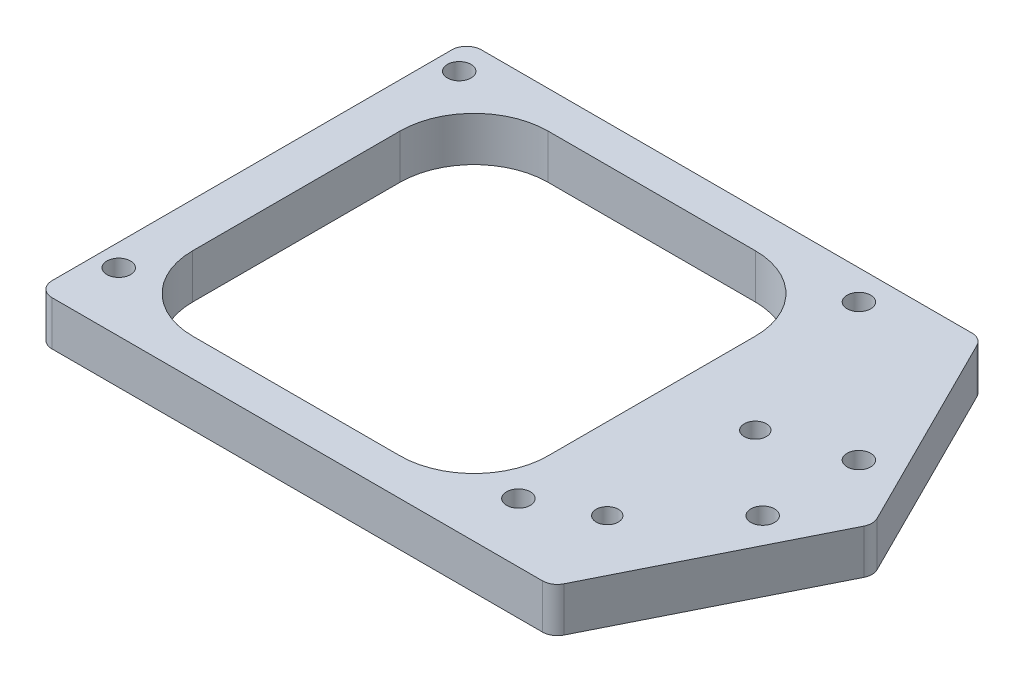
ISO-10303-21;
HEADER;
FILE_DESCRIPTION(('STEP AP214'),'2;1');
FILE_NAME('part.step','',(''),(''),'','','');
FILE_SCHEMA(('AUTOMOTIVE_DESIGN { 1 0 10303 214 1 1 1 1 }'));
ENDSEC;
DATA;
#1=APPLICATION_CONTEXT('core data for automotive mechanical design processes');
#2=APPLICATION_PROTOCOL_DEFINITION('international standard','automotive_design',2000,#1);
#3=PRODUCT_CONTEXT('',#1,'mechanical');
#4=PRODUCT('Part','Part','',(#3));
#5=PRODUCT_RELATED_PRODUCT_CATEGORY('part','',(#4));
#6=PRODUCT_DEFINITION_FORMATION('','',#4);
#7=PRODUCT_DEFINITION_CONTEXT('part definition',#1,'design');
#8=PRODUCT_DEFINITION('design','',#6,#7);
#9=PRODUCT_DEFINITION_SHAPE('','',#8);
#10=(LENGTH_UNIT() NAMED_UNIT(*) SI_UNIT(.MILLI.,.METRE.));
#11=(NAMED_UNIT(*) PLANE_ANGLE_UNIT() SI_UNIT($,.RADIAN.));
#12=(NAMED_UNIT(*) SI_UNIT($,.STERADIAN.) SOLID_ANGLE_UNIT());
#13=UNCERTAINTY_MEASURE_WITH_UNIT(LENGTH_MEASURE(1.E-05),#10,'distance_accuracy_value','');
#14=(GEOMETRIC_REPRESENTATION_CONTEXT(3) GLOBAL_UNCERTAINTY_ASSIGNED_CONTEXT((#13)) GLOBAL_UNIT_ASSIGNED_CONTEXT((#10,
#11,#12)) REPRESENTATION_CONTEXT('',''));
#15=CARTESIAN_POINT('',(0.,0.,0.));
#16=DIRECTION('',(0.,0.,1.));
#17=DIRECTION('',(1.,0.,0.));
#18=AXIS2_PLACEMENT_3D('',#15,#16,#17);
#19=CARTESIAN_POINT('',(0.,-1.5,0.));
#20=DIRECTION('',(0.,-1.,0.));
#21=DIRECTION('',(0.,0.,-1.));
#22=AXIS2_PLACEMENT_3D('',#19,#20,#21);
#23=PLANE('',#22);
#24=CARTESIAN_POINT('',(32.5,-1.5,-16.));
#25=DIRECTION('',(0.,1.,0.));
#26=DIRECTION('',(0.,0.,1.));
#27=AXIS2_PLACEMENT_3D('',#24,#25,#26);
#28=CIRCLE('',#27,0.750000000000001);
#29=CARTESIAN_POINT('',(32.5,-1.5,-15.25));
#30=VERTEX_POINT('',#29);
#31=EDGE_CURVE('E391',#30,#30,#28,.T.);
#32=ORIENTED_EDGE('',*,*,#31,.T.);
#33=EDGE_LOOP('',(#32));
#34=FACE_BOUND('',#33,.T.);
#35=DIRECTION('',(0.,0.,1.));
#36=VECTOR('',#35,1.);
#37=CARTESIAN_POINT('',(0.,-1.5,0.));
#38=LINE('',#37,#36);
#39=CARTESIAN_POINT('',(0.,-1.5,-28.));
#40=VERTEX_POINT('',#39);
#41=CARTESIAN_POINT('',(0.,-1.5,-1.));
#42=VERTEX_POINT('',#41);
#43=EDGE_CURVE('E278',#40,#42,#38,.T.);
#44=ORIENTED_EDGE('',*,*,#43,.F.);
#45=CARTESIAN_POINT('',(1.,-1.5,-28.));
#46=DIRECTION('',(0.,-1.,0.));
#47=DIRECTION('',(0.,0.,-1.));
#48=AXIS2_PLACEMENT_3D('',#45,#46,#47);
#49=CIRCLE('',#48,1.);
#50=CARTESIAN_POINT('',(1.,-1.5,-29.));
#51=VERTEX_POINT('',#50);
#52=EDGE_CURVE('E236',#40,#51,#49,.T.);
#53=ORIENTED_EDGE('',*,*,#52,.T.);
#54=DIRECTION('',(-1.,0.,0.));
#55=VECTOR('',#54,1.);
#56=CARTESIAN_POINT('',(0.,-1.5,-29.));
#57=LINE('',#56,#55);
#58=CARTESIAN_POINT('',(34.1304601092614,-1.5,-29.));
#59=VERTEX_POINT('',#58);
#60=EDGE_CURVE('E286',#59,#51,#57,.T.);
#61=ORIENTED_EDGE('',*,*,#60,.F.);
#62=CARTESIAN_POINT('',(34.1304601092614,-1.5,-28.));
#63=DIRECTION('',(0.,-1.,0.));
#64=DIRECTION('',(0.,0.,-1.));
#65=AXIS2_PLACEMENT_3D('',#62,#63,#64);
#66=CIRCLE('',#65,1.);
#67=CARTESIAN_POINT('',(35.0248486696314,-1.5,-28.4472908484187));
#68=VERTEX_POINT('',#67);
#69=EDGE_CURVE('E234',#59,#68,#66,.T.);
#70=ORIENTED_EDGE('',*,*,#69,.T.);
#71=DIRECTION('',(-0.447290848418716,0.,-0.894388560370081));
#72=VECTOR('',#71,1.);
#73=CARTESIAN_POINT('',(42.,-1.5,-14.5));
#74=LINE('',#73,#72);
#75=CARTESIAN_POINT('',(41.7763062812472,-1.5,-14.9472908484187));
#76=VERTEX_POINT('',#75);
#77=EDGE_CURVE('E281',#76,#68,#74,.T.);
#78=ORIENTED_EDGE('',*,*,#77,.F.);
#79=CARTESIAN_POINT('',(40.8819177208771,-1.5,-14.5));
#80=DIRECTION('',(0.,-1.,0.));
#81=DIRECTION('',(0.,0.,-1.));
#82=AXIS2_PLACEMENT_3D('',#79,#80,#81);
#83=CIRCLE('',#82,1.);
#84=CARTESIAN_POINT('',(41.7763062812472,-1.5,-14.0527091515813));
#85=VERTEX_POINT('',#84);
#86=EDGE_CURVE('E232',#76,#85,#83,.T.);
#87=ORIENTED_EDGE('',*,*,#86,.T.);
#88=DIRECTION('',(0.447290848418714,0.,-0.894388560370081));
#89=VECTOR('',#88,1.);
#90=CARTESIAN_POINT('',(42.,-1.5,-14.5));
#91=LINE('',#90,#89);
#92=CARTESIAN_POINT('',(35.0248486696315,-1.5,-0.552709151581289));
#93=VERTEX_POINT('',#92);
#94=EDGE_CURVE('E277',#93,#85,#91,.T.);
#95=ORIENTED_EDGE('',*,*,#94,.F.);
#96=CARTESIAN_POINT('',(34.1304601092614,-1.5,-1.));
#97=DIRECTION('',(0.,-1.,0.));
#98=DIRECTION('',(0.,0.,-1.));
#99=AXIS2_PLACEMENT_3D('',#96,#97,#98);
#100=CIRCLE('',#99,1.);
#101=CARTESIAN_POINT('',(34.1304601092614,-1.5,0.));
#102=VERTEX_POINT('',#101);
#103=EDGE_CURVE('E230',#93,#102,#100,.T.);
#104=ORIENTED_EDGE('',*,*,#103,.T.);
#105=DIRECTION('',(1.,0.,0.));
#106=VECTOR('',#105,1.);
#107=CARTESIAN_POINT('',(0.,-1.5,0.));
#108=LINE('',#107,#106);
#109=CARTESIAN_POINT('',(1.,-1.5,0.));
#110=VERTEX_POINT('',#109);
#111=EDGE_CURVE('E267',#110,#102,#108,.T.);
#112=ORIENTED_EDGE('',*,*,#111,.F.);
#113=CARTESIAN_POINT('',(1.,-1.5,-1.));
#114=DIRECTION('',(0.,-1.,0.));
#115=DIRECTION('',(0.,0.,-1.));
#116=AXIS2_PLACEMENT_3D('',#113,#114,#115);
#117=CIRCLE('',#116,1.);
#118=EDGE_CURVE('E228',#110,#42,#117,.T.);
#119=ORIENTED_EDGE('',*,*,#118,.T.);
#120=EDGE_LOOP('',(#44,#53,#61,#70,#78,#87,#95,#104,#112,#119));
#121=FACE_BOUND('',#120,.T.);
#122=DIRECTION('',(-1.,0.,0.));
#123=VECTOR('',#122,1.);
#124=CARTESIAN_POINT('',(3.,-1.5,-26.5));
#125=LINE('',#124,#123);
#126=CARTESIAN_POINT('',(22.,-1.5,-26.5));
#127=VERTEX_POINT('',#126);
#128=CARTESIAN_POINT('',(8.,-1.5,-26.5));
#129=VERTEX_POINT('',#128);
#130=EDGE_CURVE('E172',#127,#129,#125,.T.);
#131=ORIENTED_EDGE('',*,*,#130,.T.);
#132=CARTESIAN_POINT('',(8.,-1.5,-21.5));
#133=DIRECTION('',(0.,-1.,0.));
#134=DIRECTION('',(0.,0.,-1.));
#135=AXIS2_PLACEMENT_3D('',#132,#133,#134);
#136=CIRCLE('',#135,5.);
#137=CARTESIAN_POINT('',(3.,-1.5,-21.5));
#138=VERTEX_POINT('',#137);
#139=EDGE_CURVE('E166',#129,#138,#136,.F.);
#140=ORIENTED_EDGE('',*,*,#139,.T.);
#141=DIRECTION('',(0.,0.,1.));
#142=VECTOR('',#141,1.);
#143=CARTESIAN_POINT('',(3.,-1.5,-26.5));
#144=LINE('',#143,#142);
#145=CARTESIAN_POINT('',(3.,-1.5,-7.50000000000001));
#146=VERTEX_POINT('',#145);
#147=EDGE_CURVE('E169',#138,#146,#144,.T.);
#148=ORIENTED_EDGE('',*,*,#147,.T.);
#149=CARTESIAN_POINT('',(8.,-1.5,-7.5));
#150=DIRECTION('',(0.,-1.,0.));
#151=DIRECTION('',(0.,0.,-1.));
#152=AXIS2_PLACEMENT_3D('',#149,#150,#151);
#153=CIRCLE('',#152,5.);
#154=CARTESIAN_POINT('',(8.,-1.5,-2.5));
#155=VERTEX_POINT('',#154);
#156=EDGE_CURVE('E221',#146,#155,#153,.F.);
#157=ORIENTED_EDGE('',*,*,#156,.T.);
#158=DIRECTION('',(1.,0.,0.));
#159=VECTOR('',#158,1.);
#160=CARTESIAN_POINT('',(3.,-1.5,-2.5));
#161=LINE('',#160,#159);
#162=CARTESIAN_POINT('',(22.,-1.5,-2.5));
#163=VERTEX_POINT('',#162);
#164=EDGE_CURVE('E187',#155,#163,#161,.T.);
#165=ORIENTED_EDGE('',*,*,#164,.T.);
#166=CARTESIAN_POINT('',(22.,-1.5,-7.5));
#167=DIRECTION('',(0.,-1.,0.));
#168=DIRECTION('',(0.,0.,-1.));
#169=AXIS2_PLACEMENT_3D('',#166,#167,#168);
#170=CIRCLE('',#169,5.);
#171=CARTESIAN_POINT('',(27.,-1.5,-7.50000000000001));
#172=VERTEX_POINT('',#171);
#173=EDGE_CURVE('E217',#163,#172,#170,.F.);
#174=ORIENTED_EDGE('',*,*,#173,.T.);
#175=DIRECTION('',(0.,0.,-1.));
#176=VECTOR('',#175,1.);
#177=CARTESIAN_POINT('',(27.,-1.5,-26.5));
#178=LINE('',#177,#176);
#179=CARTESIAN_POINT('',(27.,-1.5,-21.5));
#180=VERTEX_POINT('',#179);
#181=EDGE_CURVE('E451',#172,#180,#178,.T.);
#182=ORIENTED_EDGE('',*,*,#181,.T.);
#183=CARTESIAN_POINT('',(22.,-1.5,-21.5));
#184=DIRECTION('',(0.,-1.,0.));
#185=DIRECTION('',(0.,0.,-1.));
#186=AXIS2_PLACEMENT_3D('',#183,#184,#185);
#187=CIRCLE('',#186,5.);
#188=EDGE_CURVE('E213',#180,#127,#187,.F.);
#189=ORIENTED_EDGE('',*,*,#188,.T.);
#190=EDGE_LOOP('',(#131,#140,#148,#157,#165,#174,#182,#189));
#191=FACE_BOUND('',#190,.T.);
#192=CARTESIAN_POINT('',(1.5,-1.5,-4.));
#193=DIRECTION('',(0.,1.,0.));
#194=DIRECTION('',(0.,0.,1.));
#195=AXIS2_PLACEMENT_3D('',#192,#193,#194);
#196=CIRCLE('',#195,0.799999999999995);
#197=CARTESIAN_POINT('',(1.5,-1.5,-3.20000000000001));
#198=VERTEX_POINT('',#197);
#199=EDGE_CURVE('E437',#198,#198,#196,.T.);
#200=ORIENTED_EDGE('',*,*,#199,.T.);
#201=EDGE_LOOP('',(#200));
#202=FACE_BOUND('',#201,.T.);
#203=CARTESIAN_POINT('',(28.5,-1.5,-4.00000000000001));
#204=DIRECTION('',(0.,1.,0.));
#205=DIRECTION('',(0.,0.,1.));
#206=AXIS2_PLACEMENT_3D('',#203,#204,#205);
#207=CIRCLE('',#206,0.799999999999995);
#208=CARTESIAN_POINT('',(28.5,-1.5,-3.20000000000001));
#209=VERTEX_POINT('',#208);
#210=EDGE_CURVE('E431',#209,#209,#207,.T.);
#211=ORIENTED_EDGE('',*,*,#210,.T.);
#212=EDGE_LOOP('',(#211));
#213=FACE_BOUND('',#212,.T.);
#214=CARTESIAN_POINT('',(37.7484344171534,-1.5,-11.25));
#215=DIRECTION('',(0.,1.,0.));
#216=DIRECTION('',(0.,0.,1.));
#217=AXIS2_PLACEMENT_3D('',#214,#215,#216);
#218=CIRCLE('',#217,0.799999999999995);
#219=CARTESIAN_POINT('',(37.7484344171534,-1.5,-10.45));
#220=VERTEX_POINT('',#219);
#221=EDGE_CURVE('E425',#220,#220,#218,.T.);
#222=ORIENTED_EDGE('',*,*,#221,.T.);
#223=EDGE_LOOP('',(#222));
#224=FACE_BOUND('',#223,.T.);
#225=CARTESIAN_POINT('',(37.7484344171534,-1.5,-17.75));
#226=DIRECTION('',(0.,1.,0.));
#227=DIRECTION('',(0.,0.,1.));
#228=AXIS2_PLACEMENT_3D('',#225,#226,#227);
#229=CIRCLE('',#228,0.799999999999995);
#230=CARTESIAN_POINT('',(37.7484344171534,-1.5,-16.95));
#231=VERTEX_POINT('',#230);
#232=EDGE_CURVE('E419',#231,#231,#229,.T.);
#233=ORIENTED_EDGE('',*,*,#232,.T.);
#234=EDGE_LOOP('',(#233));
#235=FACE_BOUND('',#234,.T.);
#236=CARTESIAN_POINT('',(28.5,-1.5,-27.));
#237=DIRECTION('',(0.,1.,0.));
#238=DIRECTION('',(0.,0.,1.));
#239=AXIS2_PLACEMENT_3D('',#236,#237,#238);
#240=CIRCLE('',#239,0.799999999999995);
#241=CARTESIAN_POINT('',(28.5,-1.5,-26.2));
#242=VERTEX_POINT('',#241);
#243=EDGE_CURVE('E413',#242,#242,#240,.T.);
#244=ORIENTED_EDGE('',*,*,#243,.T.);
#245=EDGE_LOOP('',(#244));
#246=FACE_BOUND('',#245,.T.);
#247=CARTESIAN_POINT('',(1.5,-1.5,-27.));
#248=DIRECTION('',(0.,1.,0.));
#249=DIRECTION('',(0.,0.,1.));
#250=AXIS2_PLACEMENT_3D('',#247,#248,#249);
#251=CIRCLE('',#250,0.799999999999996);
#252=CARTESIAN_POINT('',(1.5,-1.5,-26.2));
#253=VERTEX_POINT('',#252);
#254=EDGE_CURVE('E407',#253,#253,#251,.T.);
#255=ORIENTED_EDGE('',*,*,#254,.T.);
#256=EDGE_LOOP('',(#255));
#257=FACE_BOUND('',#256,.T.);
#258=CARTESIAN_POINT('',(32.5,-1.5,-6.));
#259=DIRECTION('',(0.,1.,0.));
#260=DIRECTION('',(0.,0.,1.));
#261=AXIS2_PLACEMENT_3D('',#258,#259,#260);
#262=CIRCLE('',#261,0.750000000000001);
#263=CARTESIAN_POINT('',(32.5,-1.5,-5.25));
#264=VERTEX_POINT('',#263);
#265=EDGE_CURVE('E401',#264,#264,#262,.T.);
#266=ORIENTED_EDGE('',*,*,#265,.T.);
#267=EDGE_LOOP('',(#266));
#268=FACE_BOUND('',#267,.T.);
#269=ADVANCED_FACE('F39',(#34,#121,#191,#202,#213,#224,#235,#246,#257,#268),#23,.T.);
#270=CARTESIAN_POINT('',(0.,1.5,0.));
#271=DIRECTION('',(0.,-1.,0.));
#272=DIRECTION('',(0.,0.,-1.));
#273=AXIS2_PLACEMENT_3D('',#270,#271,#272);
#274=PLANE('',#273);
#275=CARTESIAN_POINT('',(32.5,1.5,-16.));
#276=DIRECTION('',(0.,1.,0.));
#277=DIRECTION('',(0.,0.,1.));
#278=AXIS2_PLACEMENT_3D('',#275,#276,#277);
#279=CIRCLE('',#278,0.750000000000001);
#280=CARTESIAN_POINT('',(32.5,1.5,-15.25));
#281=VERTEX_POINT('',#280);
#282=EDGE_CURVE('E394',#281,#281,#279,.T.);
#283=ORIENTED_EDGE('',*,*,#282,.F.);
#284=EDGE_LOOP('',(#283));
#285=FACE_BOUND('',#284,.T.);
#286=CARTESIAN_POINT('',(1.5,1.5,-27.));
#287=DIRECTION('',(0.,1.,0.));
#288=DIRECTION('',(0.,0.,1.));
#289=AXIS2_PLACEMENT_3D('',#286,#287,#288);
#290=CIRCLE('',#289,0.799999999999988);
#291=CARTESIAN_POINT('',(1.5,1.5,-26.2));
#292=VERTEX_POINT('',#291);
#293=EDGE_CURVE('E404',#292,#292,#290,.T.);
#294=ORIENTED_EDGE('',*,*,#293,.F.);
#295=EDGE_LOOP('',(#294));
#296=FACE_BOUND('',#295,.T.);
#297=CARTESIAN_POINT('',(28.5,1.5,-27.));
#298=DIRECTION('',(0.,1.,0.));
#299=DIRECTION('',(0.,0.,1.));
#300=AXIS2_PLACEMENT_3D('',#297,#298,#299);
#301=CIRCLE('',#300,0.799999999999988);
#302=CARTESIAN_POINT('',(28.5,1.5,-26.2));
#303=VERTEX_POINT('',#302);
#304=EDGE_CURVE('E410',#303,#303,#301,.T.);
#305=ORIENTED_EDGE('',*,*,#304,.F.);
#306=EDGE_LOOP('',(#305));
#307=FACE_BOUND('',#306,.T.);
#308=CARTESIAN_POINT('',(37.7484344171534,1.5,-17.75));
#309=DIRECTION('',(0.,1.,0.));
#310=DIRECTION('',(0.,0.,1.));
#311=AXIS2_PLACEMENT_3D('',#308,#309,#310);
#312=CIRCLE('',#311,0.799999999999988);
#313=CARTESIAN_POINT('',(37.7484344171534,1.5,-16.95));
#314=VERTEX_POINT('',#313);
#315=EDGE_CURVE('E416',#314,#314,#312,.T.);
#316=ORIENTED_EDGE('',*,*,#315,.F.);
#317=EDGE_LOOP('',(#316));
#318=FACE_BOUND('',#317,.T.);
#319=CARTESIAN_POINT('',(37.7484344171534,1.5,-11.25));
#320=DIRECTION('',(0.,1.,0.));
#321=DIRECTION('',(0.,0.,1.));
#322=AXIS2_PLACEMENT_3D('',#319,#320,#321);
#323=CIRCLE('',#322,0.799999999999988);
#324=CARTESIAN_POINT('',(37.7484344171534,1.5,-10.45));
#325=VERTEX_POINT('',#324);
#326=EDGE_CURVE('E422',#325,#325,#323,.T.);
#327=ORIENTED_EDGE('',*,*,#326,.F.);
#328=EDGE_LOOP('',(#327));
#329=FACE_BOUND('',#328,.T.);
#330=CARTESIAN_POINT('',(28.5,1.5,-4.00000000000001));
#331=DIRECTION('',(0.,1.,0.));
#332=DIRECTION('',(0.,0.,1.));
#333=AXIS2_PLACEMENT_3D('',#330,#331,#332);
#334=CIRCLE('',#333,0.799999999999988);
#335=CARTESIAN_POINT('',(28.5,1.5,-3.20000000000002));
#336=VERTEX_POINT('',#335);
#337=EDGE_CURVE('E428',#336,#336,#334,.T.);
#338=ORIENTED_EDGE('',*,*,#337,.F.);
#339=EDGE_LOOP('',(#338));
#340=FACE_BOUND('',#339,.T.);
#341=DIRECTION('',(1.,0.,0.));
#342=VECTOR('',#341,1.);
#343=CARTESIAN_POINT('',(3.,1.5,-2.5));
#344=LINE('',#343,#342);
#345=CARTESIAN_POINT('',(8.,1.5,-2.5));
#346=VERTEX_POINT('',#345);
#347=CARTESIAN_POINT('',(22.,1.5,-2.5));
#348=VERTEX_POINT('',#347);
#349=EDGE_CURVE('E442',#346,#348,#344,.T.);
#350=ORIENTED_EDGE('',*,*,#349,.F.);
#351=CARTESIAN_POINT('',(8.,1.5,-7.5));
#352=DIRECTION('',(0.,-1.,0.));
#353=DIRECTION('',(0.,0.,-1.));
#354=AXIS2_PLACEMENT_3D('',#351,#352,#353);
#355=CIRCLE('',#354,5.);
#356=CARTESIAN_POINT('',(3.,1.5,-7.50000000000001));
#357=VERTEX_POINT('',#356);
#358=EDGE_CURVE('E219',#346,#357,#355,.T.);
#359=ORIENTED_EDGE('',*,*,#358,.T.);
#360=DIRECTION('',(0.,0.,1.));
#361=VECTOR('',#360,1.);
#362=CARTESIAN_POINT('',(3.,1.5,-26.5));
#363=LINE('',#362,#361);
#364=CARTESIAN_POINT('',(3.,1.5,-21.5));
#365=VERTEX_POINT('',#364);
#366=EDGE_CURVE('E440',#365,#357,#363,.T.);
#367=ORIENTED_EDGE('',*,*,#366,.F.);
#368=CARTESIAN_POINT('',(8.,1.5,-21.5));
#369=DIRECTION('',(0.,-1.,0.));
#370=DIRECTION('',(0.,0.,-1.));
#371=AXIS2_PLACEMENT_3D('',#368,#369,#370);
#372=CIRCLE('',#371,5.);
#373=CARTESIAN_POINT('',(8.,1.5,-26.5));
#374=VERTEX_POINT('',#373);
#375=EDGE_CURVE('E177',#365,#374,#372,.T.);
#376=ORIENTED_EDGE('',*,*,#375,.T.);
#377=DIRECTION('',(-1.,0.,0.));
#378=VECTOR('',#377,1.);
#379=CARTESIAN_POINT('',(3.,1.5,-26.5));
#380=LINE('',#379,#378);
#381=CARTESIAN_POINT('',(22.,1.5,-26.5));
#382=VERTEX_POINT('',#381);
#383=EDGE_CURVE('E188',#382,#374,#380,.T.);
#384=ORIENTED_EDGE('',*,*,#383,.F.);
#385=CARTESIAN_POINT('',(22.,1.5,-21.5));
#386=DIRECTION('',(0.,-1.,0.));
#387=DIRECTION('',(0.,0.,-1.));
#388=AXIS2_PLACEMENT_3D('',#385,#386,#387);
#389=CIRCLE('',#388,5.);
#390=CARTESIAN_POINT('',(27.,1.5,-21.5));
#391=VERTEX_POINT('',#390);
#392=EDGE_CURVE('E176',#382,#391,#389,.T.);
#393=ORIENTED_EDGE('',*,*,#392,.T.);
#394=DIRECTION('',(0.,0.,-1.));
#395=VECTOR('',#394,1.);
#396=CARTESIAN_POINT('',(27.,1.5,-26.5));
#397=LINE('',#396,#395);
#398=CARTESIAN_POINT('',(27.,1.5,-7.50000000000001));
#399=VERTEX_POINT('',#398);
#400=EDGE_CURVE('E445',#399,#391,#397,.T.);
#401=ORIENTED_EDGE('',*,*,#400,.F.);
#402=CARTESIAN_POINT('',(22.,1.5,-7.5));
#403=DIRECTION('',(0.,-1.,0.));
#404=DIRECTION('',(0.,0.,-1.));
#405=AXIS2_PLACEMENT_3D('',#402,#403,#404);
#406=CIRCLE('',#405,5.);
#407=EDGE_CURVE('E215',#399,#348,#406,.T.);
#408=ORIENTED_EDGE('',*,*,#407,.T.);
#409=EDGE_LOOP('',(#350,#359,#367,#376,#384,#393,#401,#408));
#410=FACE_BOUND('',#409,.T.);
#411=DIRECTION('',(-1.,0.,0.));
#412=VECTOR('',#411,1.);
#413=CARTESIAN_POINT('',(0.,1.5,-29.));
#414=LINE('',#413,#412);
#415=CARTESIAN_POINT('',(34.1304601092614,1.5,-29.));
#416=VERTEX_POINT('',#415);
#417=CARTESIAN_POINT('',(1.,1.5,-29.));
#418=VERTEX_POINT('',#417);
#419=EDGE_CURVE('E196',#416,#418,#414,.T.);
#420=ORIENTED_EDGE('',*,*,#419,.T.);
#421=CARTESIAN_POINT('',(1.,1.5,-28.));
#422=DIRECTION('',(0.,-1.,0.));
#423=DIRECTION('',(0.,0.,-1.));
#424=AXIS2_PLACEMENT_3D('',#421,#422,#423);
#425=CIRCLE('',#424,1.);
#426=CARTESIAN_POINT('',(0.,1.5,-28.));
#427=VERTEX_POINT('',#426);
#428=EDGE_CURVE('E250',#418,#427,#425,.F.);
#429=ORIENTED_EDGE('',*,*,#428,.T.);
#430=DIRECTION('',(0.,0.,1.));
#431=VECTOR('',#430,1.);
#432=CARTESIAN_POINT('',(0.,1.5,0.));
#433=LINE('',#432,#431);
#434=CARTESIAN_POINT('',(0.,1.5,-1.));
#435=VERTEX_POINT('',#434);
#436=EDGE_CURVE('E288',#427,#435,#433,.T.);
#437=ORIENTED_EDGE('',*,*,#436,.T.);
#438=CARTESIAN_POINT('',(1.,1.5,-1.));
#439=DIRECTION('',(0.,-1.,0.));
#440=DIRECTION('',(0.,0.,-1.));
#441=AXIS2_PLACEMENT_3D('',#438,#439,#440);
#442=CIRCLE('',#441,1.);
#443=CARTESIAN_POINT('',(1.,1.5,0.));
#444=VERTEX_POINT('',#443);
#445=EDGE_CURVE('E243',#435,#444,#442,.F.);
#446=ORIENTED_EDGE('',*,*,#445,.T.);
#447=DIRECTION('',(1.,0.,0.));
#448=VECTOR('',#447,1.);
#449=CARTESIAN_POINT('',(0.,1.5,0.));
#450=LINE('',#449,#448);
#451=CARTESIAN_POINT('',(34.1304601092614,1.5,0.));
#452=VERTEX_POINT('',#451);
#453=EDGE_CURVE('E270',#444,#452,#450,.T.);
#454=ORIENTED_EDGE('',*,*,#453,.T.);
#455=CARTESIAN_POINT('',(34.1304601092614,1.5,-1.));
#456=DIRECTION('',(0.,-1.,0.));
#457=DIRECTION('',(0.,0.,-1.));
#458=AXIS2_PLACEMENT_3D('',#455,#456,#457);
#459=CIRCLE('',#458,1.);
#460=CARTESIAN_POINT('',(35.0248486696315,1.5,-0.552709151581289));
#461=VERTEX_POINT('',#460);
#462=EDGE_CURVE('E245',#452,#461,#459,.F.);
#463=ORIENTED_EDGE('',*,*,#462,.T.);
#464=DIRECTION('',(0.447290848418714,0.,-0.894388560370081));
#465=VECTOR('',#464,1.);
#466=CARTESIAN_POINT('',(42.,1.5,-14.5));
#467=LINE('',#466,#465);
#468=CARTESIAN_POINT('',(41.7763062812472,1.5,-14.0527091515813));
#469=VERTEX_POINT('',#468);
#470=EDGE_CURVE('E295',#461,#469,#467,.T.);
#471=ORIENTED_EDGE('',*,*,#470,.T.);
#472=CARTESIAN_POINT('',(40.8819177208771,1.5,-14.5));
#473=DIRECTION('',(0.,-1.,0.));
#474=DIRECTION('',(0.,0.,-1.));
#475=AXIS2_PLACEMENT_3D('',#472,#473,#474);
#476=CIRCLE('',#475,1.);
#477=CARTESIAN_POINT('',(41.7763062812472,1.5,-14.9472908484187));
#478=VERTEX_POINT('',#477);
#479=EDGE_CURVE('E61',#469,#478,#476,.F.);
#480=ORIENTED_EDGE('',*,*,#479,.T.);
#481=DIRECTION('',(-0.447290848418716,0.,-0.894388560370081));
#482=VECTOR('',#481,1.);
#483=CARTESIAN_POINT('',(42.,1.5,-14.5));
#484=LINE('',#483,#482);
#485=CARTESIAN_POINT('',(35.0248486696314,1.5,-28.4472908484187));
#486=VERTEX_POINT('',#485);
#487=EDGE_CURVE('E301',#478,#486,#484,.T.);
#488=ORIENTED_EDGE('',*,*,#487,.T.);
#489=CARTESIAN_POINT('',(34.1304601092614,1.5,-28.));
#490=DIRECTION('',(0.,-1.,0.));
#491=DIRECTION('',(0.,0.,-1.));
#492=AXIS2_PLACEMENT_3D('',#489,#490,#491);
#493=CIRCLE('',#492,1.);
#494=EDGE_CURVE('E248',#486,#416,#493,.F.);
#495=ORIENTED_EDGE('',*,*,#494,.T.);
#496=EDGE_LOOP('',(#420,#429,#437,#446,#454,#463,#471,#480,#488,#495));
#497=FACE_BOUND('',#496,.T.);
#498=CARTESIAN_POINT('',(1.5,1.5,-4.));
#499=DIRECTION('',(0.,1.,0.));
#500=DIRECTION('',(0.,0.,1.));
#501=AXIS2_PLACEMENT_3D('',#498,#499,#500);
#502=CIRCLE('',#501,0.799999999999988);
#503=CARTESIAN_POINT('',(1.5,1.5,-3.20000000000002));
#504=VERTEX_POINT('',#503);
#505=EDGE_CURVE('E434',#504,#504,#502,.T.);
#506=ORIENTED_EDGE('',*,*,#505,.F.);
#507=EDGE_LOOP('',(#506));
#508=FACE_BOUND('',#507,.T.);
#509=CARTESIAN_POINT('',(32.5,1.5,-6.));
#510=DIRECTION('',(0.,1.,0.));
#511=DIRECTION('',(0.,0.,1.));
#512=AXIS2_PLACEMENT_3D('',#509,#510,#511);
#513=CIRCLE('',#512,0.750000000000001);
#514=CARTESIAN_POINT('',(32.5,1.5,-5.25));
#515=VERTEX_POINT('',#514);
#516=EDGE_CURVE('E396',#515,#515,#513,.T.);
#517=ORIENTED_EDGE('',*,*,#516,.F.);
#518=EDGE_LOOP('',(#517));
#519=FACE_BOUND('',#518,.T.);
#520=ADVANCED_FACE('F305',(#285,#296,#307,#318,#329,#340,#410,#497,#508,#519),#274,.F.);
#521=CARTESIAN_POINT('',(0.,1.5,0.));
#522=DIRECTION('',(1.,0.,0.));
#523=DIRECTION('',(0.,0.,-1.));
#524=AXIS2_PLACEMENT_3D('',#521,#522,#523);
#525=PLANE('',#524);
#526=ORIENTED_EDGE('',*,*,#436,.F.);
#527=DIRECTION('',(0.,-1.,0.));
#528=VECTOR('',#527,1.);
#529=CARTESIAN_POINT('',(0.,1.5,-28.));
#530=LINE('',#529,#528);
#531=EDGE_CURVE('E225',#427,#40,#530,.T.);
#532=ORIENTED_EDGE('',*,*,#531,.T.);
#533=ORIENTED_EDGE('',*,*,#43,.T.);
#534=DIRECTION('',(0.,-1.,0.));
#535=VECTOR('',#534,1.);
#536=CARTESIAN_POINT('',(0.,1.5,-1.));
#537=LINE('',#536,#535);
#538=EDGE_CURVE('E223',#42,#435,#537,.F.);
#539=ORIENTED_EDGE('',*,*,#538,.T.);
#540=EDGE_LOOP('',(#526,#532,#533,#539));
#541=FACE_BOUND('',#540,.T.);
#542=ADVANCED_FACE('F313',(#541),#525,.F.);
#543=CARTESIAN_POINT('',(0.,1.5,0.));
#544=DIRECTION('',(0.,0.,-1.));
#545=DIRECTION('',(-1.,0.,0.));
#546=AXIS2_PLACEMENT_3D('',#543,#544,#545);
#547=PLANE('',#546);
#548=ORIENTED_EDGE('',*,*,#111,.T.);
#549=DIRECTION('',(0.,-1.,0.));
#550=VECTOR('',#549,1.);
#551=CARTESIAN_POINT('',(34.1304601092614,1.5,0.));
#552=LINE('',#551,#550);
#553=EDGE_CURVE('E11',#102,#452,#552,.F.);
#554=ORIENTED_EDGE('',*,*,#553,.T.);
#555=ORIENTED_EDGE('',*,*,#453,.F.);
#556=DIRECTION('',(0.,-1.,0.));
#557=VECTOR('',#556,1.);
#558=CARTESIAN_POINT('',(1.,1.5,0.));
#559=LINE('',#558,#557);
#560=EDGE_CURVE('E47',#444,#110,#559,.T.);
#561=ORIENTED_EDGE('',*,*,#560,.T.);
#562=EDGE_LOOP('',(#548,#554,#555,#561));
#563=FACE_BOUND('',#562,.T.);
#564=ADVANCED_FACE('F266',(#563),#547,.F.);
#565=CARTESIAN_POINT('',(42.,1.5,-14.5));
#566=DIRECTION('',(-0.894388560370082,0.,-0.447290848418714));
#567=DIRECTION('',(-0.447290848418714,0.,0.894388560370082));
#568=AXIS2_PLACEMENT_3D('',#565,#566,#567);
#569=PLANE('',#568);
#570=ORIENTED_EDGE('',*,*,#94,.T.);
#571=DIRECTION('',(0.,-1.,0.));
#572=VECTOR('',#571,1.);
#573=CARTESIAN_POINT('',(41.7763062812472,1.5,-14.0527091515813));
#574=LINE('',#573,#572);
#575=EDGE_CURVE('E259',#85,#469,#574,.F.);
#576=ORIENTED_EDGE('',*,*,#575,.T.);
#577=ORIENTED_EDGE('',*,*,#470,.F.);
#578=DIRECTION('',(0.,-1.,0.));
#579=VECTOR('',#578,1.);
#580=CARTESIAN_POINT('',(35.0248486696315,1.5,-0.552709151581289));
#581=LINE('',#580,#579);
#582=EDGE_CURVE('E256',#461,#93,#581,.T.);
#583=ORIENTED_EDGE('',*,*,#582,.T.);
#584=EDGE_LOOP('',(#570,#576,#577,#583));
#585=FACE_BOUND('',#584,.T.);
#586=ADVANCED_FACE('F330',(#585),#569,.F.);
#587=CARTESIAN_POINT('',(42.,1.5,-14.5));
#588=DIRECTION('',(-0.894388560370081,0.,0.447290848418716));
#589=DIRECTION('',(0.447290848418716,0.,0.894388560370081));
#590=AXIS2_PLACEMENT_3D('',#587,#588,#589);
#591=PLANE('',#590);
#592=ORIENTED_EDGE('',*,*,#77,.T.);
#593=DIRECTION('',(0.,-1.,0.));
#594=VECTOR('',#593,1.);
#595=CARTESIAN_POINT('',(35.0248486696314,1.5,-28.4472908484187));
#596=LINE('',#595,#594);
#597=EDGE_CURVE('E54',#68,#486,#596,.F.);
#598=ORIENTED_EDGE('',*,*,#597,.T.);
#599=ORIENTED_EDGE('',*,*,#487,.F.);
#600=DIRECTION('',(0.,-1.,0.));
#601=VECTOR('',#600,1.);
#602=CARTESIAN_POINT('',(41.7763062812472,1.5,-14.9472908484187));
#603=LINE('',#602,#601);
#604=EDGE_CURVE('E252',#478,#76,#603,.T.);
#605=ORIENTED_EDGE('',*,*,#604,.T.);
#606=EDGE_LOOP('',(#592,#598,#599,#605));
#607=FACE_BOUND('',#606,.T.);
#608=ADVANCED_FACE('F317',(#607),#591,.F.);
#609=CARTESIAN_POINT('',(0.,1.5,-29.));
#610=DIRECTION('',(0.,0.,1.));
#611=DIRECTION('',(1.,0.,0.));
#612=AXIS2_PLACEMENT_3D('',#609,#610,#611);
#613=PLANE('',#612);
#614=ORIENTED_EDGE('',*,*,#60,.T.);
#615=DIRECTION('',(0.,-1.,0.));
#616=VECTOR('',#615,1.);
#617=CARTESIAN_POINT('',(1.,1.5,-29.));
#618=LINE('',#617,#616);
#619=EDGE_CURVE('E241',#51,#418,#618,.F.);
#620=ORIENTED_EDGE('',*,*,#619,.T.);
#621=ORIENTED_EDGE('',*,*,#419,.F.);
#622=DIRECTION('',(0.,-1.,0.));
#623=VECTOR('',#622,1.);
#624=CARTESIAN_POINT('',(34.1304601092614,1.5,-29.));
#625=LINE('',#624,#623);
#626=EDGE_CURVE('E238',#416,#59,#625,.T.);
#627=ORIENTED_EDGE('',*,*,#626,.T.);
#628=EDGE_LOOP('',(#614,#620,#621,#627));
#629=FACE_BOUND('',#628,.T.);
#630=ADVANCED_FACE('F320',(#629),#613,.F.);
#631=CARTESIAN_POINT('',(3.,-1.5,-26.5));
#632=DIRECTION('',(-1.,0.,0.));
#633=DIRECTION('',(0.,0.,1.));
#634=AXIS2_PLACEMENT_3D('',#631,#632,#633);
#635=PLANE('',#634);
#636=ORIENTED_EDGE('',*,*,#147,.F.);
#637=DIRECTION('',(0.,1.,0.));
#638=VECTOR('',#637,1.);
#639=CARTESIAN_POINT('',(3.,1.5,-21.5));
#640=LINE('',#639,#638);
#641=EDGE_CURVE('E183',#138,#365,#640,.T.);
#642=ORIENTED_EDGE('',*,*,#641,.T.);
#643=ORIENTED_EDGE('',*,*,#366,.T.);
#644=DIRECTION('',(0.,1.,0.));
#645=VECTOR('',#644,1.);
#646=CARTESIAN_POINT('',(3.,-1.5,-7.5));
#647=LINE('',#646,#645);
#648=EDGE_CURVE('E186',#357,#146,#647,.F.);
#649=ORIENTED_EDGE('',*,*,#648,.T.);
#650=EDGE_LOOP('',(#636,#642,#643,#649));
#651=FACE_BOUND('',#650,.T.);
#652=ADVANCED_FACE('F181',(#651),#635,.F.);
#653=CARTESIAN_POINT('',(3.,-1.5,-26.5));
#654=DIRECTION('',(0.,0.,-1.));
#655=DIRECTION('',(-1.,0.,0.));
#656=AXIS2_PLACEMENT_3D('',#653,#654,#655);
#657=PLANE('',#656);
#658=ORIENTED_EDGE('',*,*,#383,.T.);
#659=DIRECTION('',(0.,1.,0.));
#660=VECTOR('',#659,1.);
#661=CARTESIAN_POINT('',(8.,-1.5,-26.5));
#662=LINE('',#661,#660);
#663=EDGE_CURVE('E194',#374,#129,#662,.F.);
#664=ORIENTED_EDGE('',*,*,#663,.T.);
#665=ORIENTED_EDGE('',*,*,#130,.F.);
#666=DIRECTION('',(0.,1.,0.));
#667=VECTOR('',#666,1.);
#668=CARTESIAN_POINT('',(22.,1.5,-26.5));
#669=LINE('',#668,#667);
#670=EDGE_CURVE('E191',#127,#382,#669,.T.);
#671=ORIENTED_EDGE('',*,*,#670,.T.);
#672=EDGE_LOOP('',(#658,#664,#665,#671));
#673=FACE_BOUND('',#672,.T.);
#674=ADVANCED_FACE('F328',(#673),#657,.F.);
#675=CARTESIAN_POINT('',(27.,-1.5,-26.5));
#676=DIRECTION('',(1.,0.,0.));
#677=DIRECTION('',(0.,0.,-1.));
#678=AXIS2_PLACEMENT_3D('',#675,#676,#677);
#679=PLANE('',#678);
#680=ORIENTED_EDGE('',*,*,#400,.T.);
#681=DIRECTION('',(0.,1.,0.));
#682=VECTOR('',#681,1.);
#683=CARTESIAN_POINT('',(27.,-1.5,-21.5));
#684=LINE('',#683,#682);
#685=EDGE_CURVE('E204',#391,#180,#684,.F.);
#686=ORIENTED_EDGE('',*,*,#685,.T.);
#687=ORIENTED_EDGE('',*,*,#181,.F.);
#688=DIRECTION('',(0.,1.,0.));
#689=VECTOR('',#688,1.);
#690=CARTESIAN_POINT('',(27.,1.5,-7.5));
#691=LINE('',#690,#689);
#692=EDGE_CURVE('E201',#172,#399,#691,.T.);
#693=ORIENTED_EDGE('',*,*,#692,.T.);
#694=EDGE_LOOP('',(#680,#686,#687,#693));
#695=FACE_BOUND('',#694,.T.);
#696=ADVANCED_FACE('F346',(#695),#679,.F.);
#697=CARTESIAN_POINT('',(3.,-1.5,-2.5));
#698=DIRECTION('',(0.,0.,1.));
#699=DIRECTION('',(1.,0.,0.));
#700=AXIS2_PLACEMENT_3D('',#697,#698,#699);
#701=PLANE('',#700);
#702=ORIENTED_EDGE('',*,*,#349,.T.);
#703=DIRECTION('',(0.,1.,0.));
#704=VECTOR('',#703,1.);
#705=CARTESIAN_POINT('',(22.,-1.5,-2.5));
#706=LINE('',#705,#704);
#707=EDGE_CURVE('E209',#348,#163,#706,.F.);
#708=ORIENTED_EDGE('',*,*,#707,.T.);
#709=ORIENTED_EDGE('',*,*,#164,.F.);
#710=DIRECTION('',(0.,1.,0.));
#711=VECTOR('',#710,1.);
#712=CARTESIAN_POINT('',(8.,1.5,-2.5));
#713=LINE('',#712,#711);
#714=EDGE_CURVE('E206',#155,#346,#713,.T.);
#715=ORIENTED_EDGE('',*,*,#714,.T.);
#716=EDGE_LOOP('',(#702,#708,#709,#715));
#717=FACE_BOUND('',#716,.T.);
#718=ADVANCED_FACE('F343',(#717),#701,.F.);
#719=CARTESIAN_POINT('',(8.,-1.5,-21.5));
#720=DIRECTION('',(0.,-1.,0.));
#721=DIRECTION('',(0.,0.,-1.));
#722=AXIS2_PLACEMENT_3D('',#719,#720,#721);
#723=CYLINDRICAL_SURFACE('',#722,5.);
#724=ORIENTED_EDGE('',*,*,#139,.F.);
#725=ORIENTED_EDGE('',*,*,#663,.F.);
#726=ORIENTED_EDGE('',*,*,#375,.F.);
#727=ORIENTED_EDGE('',*,*,#641,.F.);
#728=EDGE_LOOP('',(#724,#725,#726,#727));
#729=FACE_BOUND('',#728,.T.);
#730=ADVANCED_FACE('F190',(#729),#723,.F.);
#731=CARTESIAN_POINT('',(22.,-1.5,-21.5));
#732=DIRECTION('',(0.,-1.,0.));
#733=DIRECTION('',(0.,0.,-1.));
#734=AXIS2_PLACEMENT_3D('',#731,#732,#733);
#735=CYLINDRICAL_SURFACE('',#734,5.);
#736=ORIENTED_EDGE('',*,*,#188,.F.);
#737=ORIENTED_EDGE('',*,*,#685,.F.);
#738=ORIENTED_EDGE('',*,*,#392,.F.);
#739=ORIENTED_EDGE('',*,*,#670,.F.);
#740=EDGE_LOOP('',(#736,#737,#738,#739));
#741=FACE_BOUND('',#740,.T.);
#742=ADVANCED_FACE('F460',(#741),#735,.F.);
#743=CARTESIAN_POINT('',(22.,-1.5,-7.5));
#744=DIRECTION('',(0.,-1.,0.));
#745=DIRECTION('',(0.,0.,-1.));
#746=AXIS2_PLACEMENT_3D('',#743,#744,#745);
#747=CYLINDRICAL_SURFACE('',#746,5.);
#748=ORIENTED_EDGE('',*,*,#173,.F.);
#749=ORIENTED_EDGE('',*,*,#707,.F.);
#750=ORIENTED_EDGE('',*,*,#407,.F.);
#751=ORIENTED_EDGE('',*,*,#692,.F.);
#752=EDGE_LOOP('',(#748,#749,#750,#751));
#753=FACE_BOUND('',#752,.T.);
#754=ADVANCED_FACE('F470',(#753),#747,.F.);
#755=CARTESIAN_POINT('',(8.,-1.5,-7.5));
#756=DIRECTION('',(0.,-1.,0.));
#757=DIRECTION('',(0.,0.,-1.));
#758=AXIS2_PLACEMENT_3D('',#755,#756,#757);
#759=CYLINDRICAL_SURFACE('',#758,5.);
#760=ORIENTED_EDGE('',*,*,#156,.F.);
#761=ORIENTED_EDGE('',*,*,#648,.F.);
#762=ORIENTED_EDGE('',*,*,#358,.F.);
#763=ORIENTED_EDGE('',*,*,#714,.F.);
#764=EDGE_LOOP('',(#760,#761,#762,#763));
#765=FACE_BOUND('',#764,.T.);
#766=ADVANCED_FACE('F358',(#765),#759,.F.);
#767=CARTESIAN_POINT('',(1.5,1.5,-4.));
#768=DIRECTION('',(0.,1.,0.));
#769=DIRECTION('',(0.,0.,1.));
#770=AXIS2_PLACEMENT_3D('',#767,#768,#769);
#771=CYLINDRICAL_SURFACE('',#770,0.799999999999992);
#772=ORIENTED_EDGE('',*,*,#199,.F.);
#773=EDGE_LOOP('',(#772));
#774=FACE_BOUND('',#773,.T.);
#775=ORIENTED_EDGE('',*,*,#505,.T.);
#776=EDGE_LOOP('',(#775));
#777=FACE_BOUND('',#776,.T.);
#778=ADVANCED_FACE('F354',(#774,#777),#771,.F.);
#779=CARTESIAN_POINT('',(28.5,1.5,-4.00000000000001));
#780=DIRECTION('',(0.,1.,0.));
#781=DIRECTION('',(0.,0.,1.));
#782=AXIS2_PLACEMENT_3D('',#779,#780,#781);
#783=CYLINDRICAL_SURFACE('',#782,0.799999999999992);
#784=ORIENTED_EDGE('',*,*,#210,.F.);
#785=EDGE_LOOP('',(#784));
#786=FACE_BOUND('',#785,.T.);
#787=ORIENTED_EDGE('',*,*,#337,.T.);
#788=EDGE_LOOP('',(#787));
#789=FACE_BOUND('',#788,.T.);
#790=ADVANCED_FACE('F357',(#786,#789),#783,.F.);
#791=CARTESIAN_POINT('',(37.7484344171534,1.5,-11.25));
#792=DIRECTION('',(0.,1.,0.));
#793=DIRECTION('',(0.,0.,1.));
#794=AXIS2_PLACEMENT_3D('',#791,#792,#793);
#795=CYLINDRICAL_SURFACE('',#794,0.799999999999992);
#796=ORIENTED_EDGE('',*,*,#221,.F.);
#797=EDGE_LOOP('',(#796));
#798=FACE_BOUND('',#797,.T.);
#799=ORIENTED_EDGE('',*,*,#326,.T.);
#800=EDGE_LOOP('',(#799));
#801=FACE_BOUND('',#800,.T.);
#802=ADVANCED_FACE('F362',(#798,#801),#795,.F.);
#803=CARTESIAN_POINT('',(37.7484344171534,1.5,-17.75));
#804=DIRECTION('',(0.,1.,0.));
#805=DIRECTION('',(0.,0.,1.));
#806=AXIS2_PLACEMENT_3D('',#803,#804,#805);
#807=CYLINDRICAL_SURFACE('',#806,0.799999999999992);
#808=ORIENTED_EDGE('',*,*,#232,.F.);
#809=EDGE_LOOP('',(#808));
#810=FACE_BOUND('',#809,.T.);
#811=ORIENTED_EDGE('',*,*,#315,.T.);
#812=EDGE_LOOP('',(#811));
#813=FACE_BOUND('',#812,.T.);
#814=ADVANCED_FACE('F366',(#810,#813),#807,.F.);
#815=CARTESIAN_POINT('',(28.5,1.5,-27.));
#816=DIRECTION('',(0.,1.,0.));
#817=DIRECTION('',(0.,0.,1.));
#818=AXIS2_PLACEMENT_3D('',#815,#816,#817);
#819=CYLINDRICAL_SURFACE('',#818,0.799999999999992);
#820=ORIENTED_EDGE('',*,*,#243,.F.);
#821=EDGE_LOOP('',(#820));
#822=FACE_BOUND('',#821,.T.);
#823=ORIENTED_EDGE('',*,*,#304,.T.);
#824=EDGE_LOOP('',(#823));
#825=FACE_BOUND('',#824,.T.);
#826=ADVANCED_FACE('F370',(#822,#825),#819,.F.);
#827=CARTESIAN_POINT('',(1.5,1.5,-27.));
#828=DIRECTION('',(0.,1.,0.));
#829=DIRECTION('',(0.,0.,1.));
#830=AXIS2_PLACEMENT_3D('',#827,#828,#829);
#831=CYLINDRICAL_SURFACE('',#830,0.799999999999992);
#832=ORIENTED_EDGE('',*,*,#254,.F.);
#833=EDGE_LOOP('',(#832));
#834=FACE_BOUND('',#833,.T.);
#835=ORIENTED_EDGE('',*,*,#293,.T.);
#836=EDGE_LOOP('',(#835));
#837=FACE_BOUND('',#836,.T.);
#838=ADVANCED_FACE('F374',(#834,#837),#831,.F.);
#839=CARTESIAN_POINT('',(32.5,1.5,-6.));
#840=DIRECTION('',(0.,1.,0.));
#841=DIRECTION('',(0.,0.,1.));
#842=AXIS2_PLACEMENT_3D('',#839,#840,#841);
#843=CYLINDRICAL_SURFACE('',#842,0.750000000000001);
#844=ORIENTED_EDGE('',*,*,#265,.F.);
#845=EDGE_LOOP('',(#844));
#846=FACE_BOUND('',#845,.T.);
#847=ORIENTED_EDGE('',*,*,#516,.T.);
#848=EDGE_LOOP('',(#847));
#849=FACE_BOUND('',#848,.T.);
#850=ADVANCED_FACE('F378',(#846,#849),#843,.F.);
#851=CARTESIAN_POINT('',(32.5,1.5,-16.));
#852=DIRECTION('',(0.,1.,0.));
#853=DIRECTION('',(0.,0.,1.));
#854=AXIS2_PLACEMENT_3D('',#851,#852,#853);
#855=CYLINDRICAL_SURFACE('',#854,0.750000000000001);
#856=ORIENTED_EDGE('',*,*,#31,.F.);
#857=EDGE_LOOP('',(#856));
#858=FACE_BOUND('',#857,.T.);
#859=ORIENTED_EDGE('',*,*,#282,.T.);
#860=EDGE_LOOP('',(#859));
#861=FACE_BOUND('',#860,.T.);
#862=ADVANCED_FACE('F382',(#858,#861),#855,.F.);
#863=CARTESIAN_POINT('',(1.,1.5,-28.));
#864=DIRECTION('',(0.,-1.,0.));
#865=DIRECTION('',(0.,0.,-1.));
#866=AXIS2_PLACEMENT_3D('',#863,#864,#865);
#867=CYLINDRICAL_SURFACE('',#866,1.);
#868=ORIENTED_EDGE('',*,*,#428,.F.);
#869=ORIENTED_EDGE('',*,*,#619,.F.);
#870=ORIENTED_EDGE('',*,*,#52,.F.);
#871=ORIENTED_EDGE('',*,*,#531,.F.);
#872=EDGE_LOOP('',(#868,#869,#870,#871));
#873=FACE_BOUND('',#872,.T.);
#874=ADVANCED_FACE('F311',(#873),#867,.T.);
#875=CARTESIAN_POINT('',(34.1304601092614,1.5,-28.));
#876=DIRECTION('',(0.,-1.,0.));
#877=DIRECTION('',(0.,0.,-1.));
#878=AXIS2_PLACEMENT_3D('',#875,#876,#877);
#879=CYLINDRICAL_SURFACE('',#878,1.);
#880=ORIENTED_EDGE('',*,*,#494,.F.);
#881=ORIENTED_EDGE('',*,*,#597,.F.);
#882=ORIENTED_EDGE('',*,*,#69,.F.);
#883=ORIENTED_EDGE('',*,*,#626,.F.);
#884=EDGE_LOOP('',(#880,#881,#882,#883));
#885=FACE_BOUND('',#884,.T.);
#886=ADVANCED_FACE('F319',(#885),#879,.T.);
#887=CARTESIAN_POINT('',(40.8819177208771,1.5,-14.5));
#888=DIRECTION('',(0.,-1.,0.));
#889=DIRECTION('',(0.,0.,-1.));
#890=AXIS2_PLACEMENT_3D('',#887,#888,#889);
#891=CYLINDRICAL_SURFACE('',#890,1.);
#892=ORIENTED_EDGE('',*,*,#479,.F.);
#893=ORIENTED_EDGE('',*,*,#575,.F.);
#894=ORIENTED_EDGE('',*,*,#86,.F.);
#895=ORIENTED_EDGE('',*,*,#604,.F.);
#896=EDGE_LOOP('',(#892,#893,#894,#895));
#897=FACE_BOUND('',#896,.T.);
#898=ADVANCED_FACE('F483',(#897),#891,.T.);
#899=CARTESIAN_POINT('',(34.1304601092614,1.5,-1.));
#900=DIRECTION('',(0.,-1.,0.));
#901=DIRECTION('',(0.,0.,-1.));
#902=AXIS2_PLACEMENT_3D('',#899,#900,#901);
#903=CYLINDRICAL_SURFACE('',#902,1.);
#904=ORIENTED_EDGE('',*,*,#462,.F.);
#905=ORIENTED_EDGE('',*,*,#553,.F.);
#906=ORIENTED_EDGE('',*,*,#103,.F.);
#907=ORIENTED_EDGE('',*,*,#582,.F.);
#908=EDGE_LOOP('',(#904,#905,#906,#907));
#909=FACE_BOUND('',#908,.T.);
#910=ADVANCED_FACE('F485',(#909),#903,.T.);
#911=CARTESIAN_POINT('',(1.,1.5,-1.));
#912=DIRECTION('',(0.,-1.,0.));
#913=DIRECTION('',(0.,0.,-1.));
#914=AXIS2_PLACEMENT_3D('',#911,#912,#913);
#915=CYLINDRICAL_SURFACE('',#914,1.);
#916=ORIENTED_EDGE('',*,*,#445,.F.);
#917=ORIENTED_EDGE('',*,*,#538,.F.);
#918=ORIENTED_EDGE('',*,*,#118,.F.);
#919=ORIENTED_EDGE('',*,*,#560,.F.);
#920=EDGE_LOOP('',(#916,#917,#918,#919));
#921=FACE_BOUND('',#920,.T.);
#922=ADVANCED_FACE('F41',(#921),#915,.T.);
#923=CLOSED_SHELL('',(#269,#520,#542,#564,#586,#608,#630,#652,#674,#696,#718,#730,#742,#754,
#766,#778,#790,#802,#814,#826,#838,#850,#862,#874,#886,#898,#910,#922));
#924=MANIFOLD_SOLID_BREP('B2',#923);
#925=ADVANCED_BREP_SHAPE_REPRESENTATION('',(#18,#924),#14);
#926=SHAPE_DEFINITION_REPRESENTATION(#9,#925);
ENDSEC;
END-ISO-10303-21;
